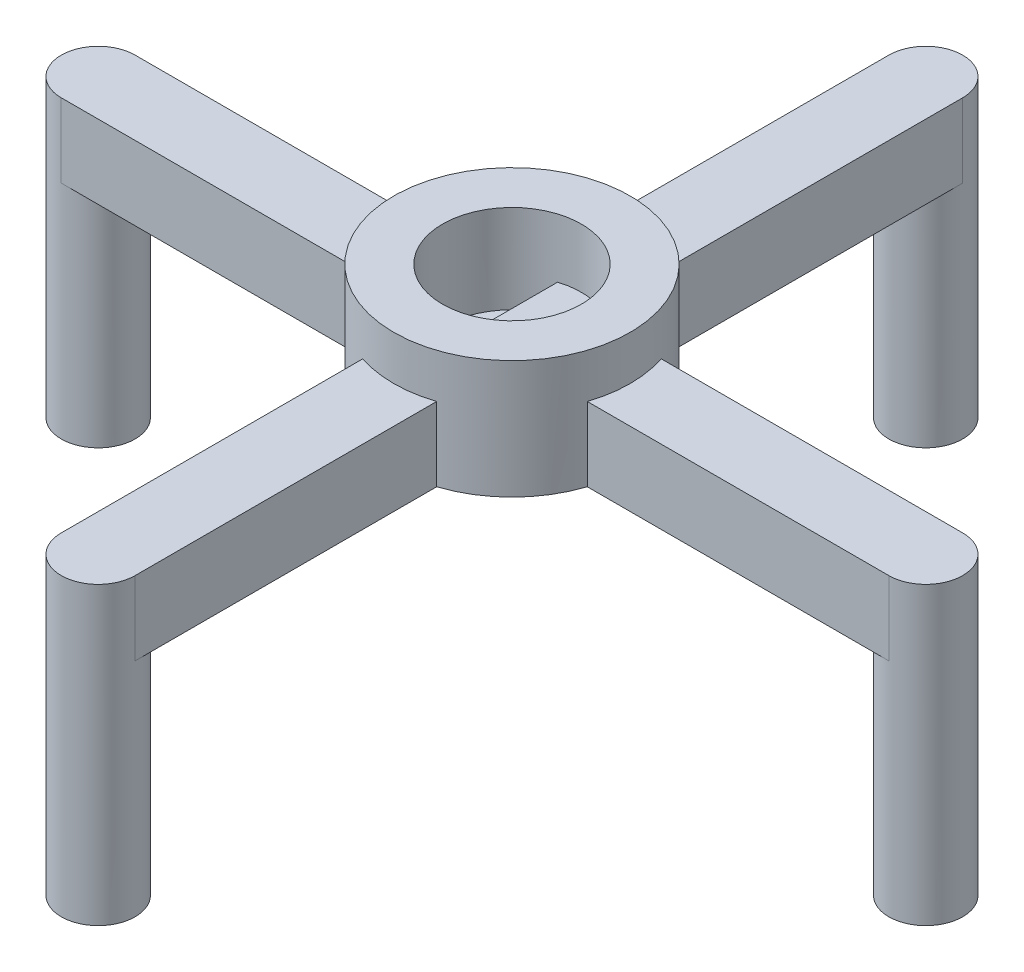
ISO-10303-21;
HEADER;
FILE_DESCRIPTION(('STEP AP214'),'2;1');
FILE_NAME('part.step','',(''),(''),'','','');
FILE_SCHEMA(('AUTOMOTIVE_DESIGN { 1 0 10303 214 1 1 1 1 }'));
ENDSEC;
DATA;
#1=APPLICATION_CONTEXT('core data for automotive mechanical design processes');
#2=APPLICATION_PROTOCOL_DEFINITION('international standard','automotive_design',2000,#1);
#3=PRODUCT_CONTEXT('',#1,'mechanical');
#4=PRODUCT('Part','Part','',(#3));
#5=PRODUCT_RELATED_PRODUCT_CATEGORY('part','',(#4));
#6=PRODUCT_DEFINITION_FORMATION('','',#4);
#7=PRODUCT_DEFINITION_CONTEXT('part definition',#1,'design');
#8=PRODUCT_DEFINITION('design','',#6,#7);
#9=PRODUCT_DEFINITION_SHAPE('','',#8);
#10=(LENGTH_UNIT() NAMED_UNIT(*) SI_UNIT(.MILLI.,.METRE.));
#11=(NAMED_UNIT(*) PLANE_ANGLE_UNIT() SI_UNIT($,.RADIAN.));
#12=(NAMED_UNIT(*) SI_UNIT($,.STERADIAN.) SOLID_ANGLE_UNIT());
#13=UNCERTAINTY_MEASURE_WITH_UNIT(LENGTH_MEASURE(1.E-05),#10,'distance_accuracy_value','');
#14=(GEOMETRIC_REPRESENTATION_CONTEXT(3) GLOBAL_UNCERTAINTY_ASSIGNED_CONTEXT((#13)) GLOBAL_UNIT_ASSIGNED_CONTEXT((#10,
#11,#12)) REPRESENTATION_CONTEXT('',''));
#15=CARTESIAN_POINT('',(0.,0.,0.));
#16=DIRECTION('',(0.,0.,1.));
#17=DIRECTION('',(1.,0.,0.));
#18=AXIS2_PLACEMENT_3D('',#15,#16,#17);
#19=CARTESIAN_POINT('',(0.,5.75,0.));
#20=DIRECTION('',(0.,-1.,0.));
#21=DIRECTION('',(0.,0.,-1.));
#22=AXIS2_PLACEMENT_3D('',#19,#20,#21);
#23=CYLINDRICAL_SURFACE('',#22,1.175);
#24=CARTESIAN_POINT('',(0.,5.75,0.));
#25=DIRECTION('',(0.,1.,0.));
#26=DIRECTION('',(0.,0.,1.));
#27=AXIS2_PLACEMENT_3D('',#24,#25,#26);
#28=CIRCLE('',#27,1.175);
#29=CARTESIAN_POINT('',(0.,5.75,1.175));
#30=VERTEX_POINT('',#29);
#31=EDGE_CURVE('E183',#30,#30,#28,.T.);
#32=ORIENTED_EDGE('',*,*,#31,.T.);
#33=EDGE_LOOP('',(#32));
#34=FACE_BOUND('',#33,.T.);
#35=CARTESIAN_POINT('',(0.,4.25,0.));
#36=DIRECTION('',(0.,1.,0.));
#37=DIRECTION('',(0.,0.,1.));
#38=AXIS2_PLACEMENT_3D('',#35,#36,#37);
#39=CIRCLE('',#38,1.175);
#40=CARTESIAN_POINT('',(-0.35,4.25,-1.12166171370873));
#41=VERTEX_POINT('',#40);
#42=CARTESIAN_POINT('',(-0.35,4.25,1.12166171370873));
#43=VERTEX_POINT('',#42);
#44=EDGE_CURVE('E184',#41,#43,#39,.T.);
#45=ORIENTED_EDGE('',*,*,#44,.F.);
#46=DIRECTION('',(0.,-1.,0.));
#47=VECTOR('',#46,1.);
#48=CARTESIAN_POINT('',(-0.35,4.75,-1.12166171370873));
#49=LINE('',#48,#47);
#50=CARTESIAN_POINT('',(-0.35,4.75,-1.12166171370873));
#51=VERTEX_POINT('',#50);
#52=EDGE_CURVE('E55',#51,#41,#49,.T.);
#53=ORIENTED_EDGE('',*,*,#52,.F.);
#54=CARTESIAN_POINT('',(0.,4.75,0.));
#55=DIRECTION('',(0.,1.,0.));
#56=DIRECTION('',(0.,0.,1.));
#57=AXIS2_PLACEMENT_3D('',#54,#55,#56);
#58=CIRCLE('',#57,1.175);
#59=CARTESIAN_POINT('',(0.349999999999999,4.75,-1.12166171370873));
#60=VERTEX_POINT('',#59);
#61=EDGE_CURVE('E60',#60,#51,#58,.T.);
#62=ORIENTED_EDGE('',*,*,#61,.F.);
#63=DIRECTION('',(0.,-1.,0.));
#64=VECTOR('',#63,1.);
#65=CARTESIAN_POINT('',(0.349999999999999,4.75,-1.12166171370873));
#66=LINE('',#65,#64);
#67=CARTESIAN_POINT('',(0.349999999999999,4.25,-1.12166171370873));
#68=VERTEX_POINT('',#67);
#69=EDGE_CURVE('E187',#60,#68,#66,.T.);
#70=ORIENTED_EDGE('',*,*,#69,.T.);
#71=CARTESIAN_POINT('',(0.35,4.25,1.12166171370873));
#72=VERTEX_POINT('',#71);
#73=EDGE_CURVE('E177',#72,#68,#39,.T.);
#74=ORIENTED_EDGE('',*,*,#73,.F.);
#75=DIRECTION('',(0.,-1.,0.));
#76=VECTOR('',#75,1.);
#77=CARTESIAN_POINT('',(0.35,4.75,1.12166171370873));
#78=LINE('',#77,#76);
#79=CARTESIAN_POINT('',(0.35,4.75,1.12166171370873));
#80=VERTEX_POINT('',#79);
#81=EDGE_CURVE('E191',#80,#72,#78,.T.);
#82=ORIENTED_EDGE('',*,*,#81,.F.);
#83=CARTESIAN_POINT('',(0.,4.75,0.));
#84=DIRECTION('',(0.,1.,0.));
#85=DIRECTION('',(0.,0.,1.));
#86=AXIS2_PLACEMENT_3D('',#83,#84,#85);
#87=CIRCLE('',#86,1.175);
#88=CARTESIAN_POINT('',(-0.35,4.75,1.12166171370873));
#89=VERTEX_POINT('',#88);
#90=EDGE_CURVE('E644',#89,#80,#87,.T.);
#91=ORIENTED_EDGE('',*,*,#90,.F.);
#92=DIRECTION('',(0.,-1.,0.));
#93=VECTOR('',#92,1.);
#94=CARTESIAN_POINT('',(-0.35,4.75,1.12166171370873));
#95=LINE('',#94,#93);
#96=EDGE_CURVE('E208',#89,#43,#95,.T.);
#97=ORIENTED_EDGE('',*,*,#96,.T.);
#98=EDGE_LOOP('',(#45,#53,#62,#70,#74,#82,#91,#97));
#99=FACE_BOUND('',#98,.T.);
#100=ADVANCED_FACE('F39',(#34,#99),#23,.F.);
#101=CARTESIAN_POINT('',(0.,4.25,0.));
#102=DIRECTION('',(0.,-1.,0.));
#103=DIRECTION('',(0.,0.,-1.));
#104=AXIS2_PLACEMENT_3D('',#101,#102,#103);
#105=PLANE('',#104);
#106=DIRECTION('',(0.,0.,1.));
#107=VECTOR('',#106,1.);
#108=CARTESIAN_POINT('',(-0.35,4.25,0.));
#109=LINE('',#108,#107);
#110=EDGE_CURVE('E196',#41,#43,#109,.T.);
#111=ORIENTED_EDGE('',*,*,#110,.F.);
#112=ORIENTED_EDGE('',*,*,#44,.T.);
#113=EDGE_LOOP('',(#111,#112));
#114=FACE_BOUND('',#113,.T.);
#115=ADVANCED_FACE('F451',(#114),#105,.F.);
#116=DIRECTION('',(0.,0.,-1.));
#117=VECTOR('',#116,1.);
#118=CARTESIAN_POINT('',(0.349999999999999,4.25,-1.12166171370873));
#119=LINE('',#118,#117);
#120=EDGE_CURVE('E180',#72,#68,#119,.T.);
#121=ORIENTED_EDGE('',*,*,#120,.F.);
#122=ORIENTED_EDGE('',*,*,#73,.T.);
#123=EDGE_LOOP('',(#121,#122));
#124=FACE_BOUND('',#123,.T.);
#125=ADVANCED_FACE('F178',(#124),#105,.F.);
#126=CARTESIAN_POINT('',(-0.625000000000026,5.,7.626));
#127=DIRECTION('',(1.,0.,0.));
#128=DIRECTION('',(0.,0.,-1.));
#129=AXIS2_PLACEMENT_3D('',#126,#127,#128);
#130=PLANE('',#129);
#131=DIRECTION('',(0.,0.,-1.));
#132=VECTOR('',#131,1.);
#133=CARTESIAN_POINT('',(-0.625000000000026,5.,7.626));
#134=LINE('',#133,#132);
#135=CARTESIAN_POINT('',(-0.625000000000025,5.,7.));
#136=VERTEX_POINT('',#135);
#137=CARTESIAN_POINT('',(-0.625000000000006,5.,1.89983551919633));
#138=VERTEX_POINT('',#137);
#139=EDGE_CURVE('E374',#136,#138,#134,.T.);
#140=ORIENTED_EDGE('',*,*,#139,.T.);
#141=DIRECTION('',(0.,-1.,0.));
#142=VECTOR('',#141,1.);
#143=CARTESIAN_POINT('',(-0.625000000000006,4.25,1.89983551919633));
#144=LINE('',#143,#142);
#145=CARTESIAN_POINT('',(-0.625000000000006,3.75,1.89983551919633));
#146=VERTEX_POINT('',#145);
#147=EDGE_CURVE('E355',#138,#146,#144,.T.);
#148=ORIENTED_EDGE('',*,*,#147,.T.);
#149=DIRECTION('',(0.,0.,-1.));
#150=VECTOR('',#149,1.);
#151=CARTESIAN_POINT('',(-0.625000000000026,3.75,7.626));
#152=LINE('',#151,#150);
#153=CARTESIAN_POINT('',(-0.625000000000024,3.75,7.));
#154=VERTEX_POINT('',#153);
#155=EDGE_CURVE('E373',#154,#146,#152,.T.);
#156=ORIENTED_EDGE('',*,*,#155,.F.);
#157=DIRECTION('',(0.,-1.,0.));
#158=VECTOR('',#157,1.);
#159=CARTESIAN_POINT('',(-0.625000000000025,5.,7.));
#160=LINE('',#159,#158);
#161=EDGE_CURVE('E379',#154,#136,#160,.F.);
#162=ORIENTED_EDGE('',*,*,#161,.T.);
#163=EDGE_LOOP('',(#140,#148,#156,#162));
#164=FACE_BOUND('',#163,.T.);
#165=ADVANCED_FACE('F613',(#164),#130,.F.);
#166=CARTESIAN_POINT('',(0.624999999999973,5.,7.626));
#167=DIRECTION('',(-1.,0.,0.));
#168=DIRECTION('',(0.,0.,1.));
#169=AXIS2_PLACEMENT_3D('',#166,#167,#168);
#170=PLANE('',#169);
#171=DIRECTION('',(0.,-1.,0.));
#172=VECTOR('',#171,1.);
#173=CARTESIAN_POINT('',(0.624999999999993,4.25,1.89983551919634));
#174=LINE('',#173,#172);
#175=CARTESIAN_POINT('',(0.624999999999993,3.75,1.89983551919634));
#176=VERTEX_POINT('',#175);
#177=CARTESIAN_POINT('',(0.624999999999993,5.,1.89983551919634));
#178=VERTEX_POINT('',#177);
#179=EDGE_CURVE('E48',#176,#178,#174,.F.);
#180=ORIENTED_EDGE('',*,*,#179,.T.);
#181=DIRECTION('',(0.,0.,-1.));
#182=VECTOR('',#181,1.);
#183=CARTESIAN_POINT('',(0.624999999999973,5.,7.626));
#184=LINE('',#183,#182);
#185=CARTESIAN_POINT('',(0.624999999999976,5.,7.));
#186=VERTEX_POINT('',#185);
#187=EDGE_CURVE('E369',#186,#178,#184,.T.);
#188=ORIENTED_EDGE('',*,*,#187,.F.);
#189=DIRECTION('',(0.,-1.,0.));
#190=VECTOR('',#189,1.);
#191=CARTESIAN_POINT('',(0.624999999999976,5.,7.));
#192=LINE('',#191,#190);
#193=CARTESIAN_POINT('',(0.624999999999975,3.75,7.));
#194=VERTEX_POINT('',#193);
#195=EDGE_CURVE('E378',#194,#186,#192,.F.);
#196=ORIENTED_EDGE('',*,*,#195,.F.);
#197=DIRECTION('',(0.,0.,-1.));
#198=VECTOR('',#197,1.);
#199=CARTESIAN_POINT('',(0.624999999999973,3.75,7.626));
#200=LINE('',#199,#198);
#201=EDGE_CURVE('E365',#194,#176,#200,.T.);
#202=ORIENTED_EDGE('',*,*,#201,.T.);
#203=EDGE_LOOP('',(#180,#188,#196,#202));
#204=FACE_BOUND('',#203,.T.);
#205=ADVANCED_FACE('F398',(#204),#170,.F.);
#206=CARTESIAN_POINT('',(-0.625000000000026,5.,7.626));
#207=DIRECTION('',(1.,0.,0.));
#208=DIRECTION('',(0.,0.,-1.));
#209=AXIS2_PLACEMENT_3D('',#206,#207,#208);
#210=PLANE('',#209);
#211=DIRECTION('',(0.,-1.,0.));
#212=VECTOR('',#211,1.);
#213=CARTESIAN_POINT('',(-0.624999999999993,4.25,-1.89983551919634));
#214=LINE('',#213,#212);
#215=CARTESIAN_POINT('',(-0.624999999999993,5.,-1.89983551919634));
#216=VERTEX_POINT('',#215);
#217=CARTESIAN_POINT('',(-0.624999999999993,3.75,-1.89983551919634));
#218=VERTEX_POINT('',#217);
#219=EDGE_CURVE('E346',#216,#218,#214,.T.);
#220=ORIENTED_EDGE('',*,*,#219,.F.);
#221=DIRECTION('',(0.,0.,-1.));
#222=VECTOR('',#221,1.);
#223=CARTESIAN_POINT('',(-0.625000000000026,5.,7.626));
#224=LINE('',#223,#222);
#225=CARTESIAN_POINT('',(-0.624999999999975,5.,-7.));
#226=VERTEX_POINT('',#225);
#227=EDGE_CURVE('E327',#216,#226,#224,.T.);
#228=ORIENTED_EDGE('',*,*,#227,.T.);
#229=DIRECTION('',(0.,-1.,0.));
#230=VECTOR('',#229,1.);
#231=CARTESIAN_POINT('',(-0.624999999999975,5.,-7.));
#232=LINE('',#231,#230);
#233=CARTESIAN_POINT('',(-0.624999999999975,3.75,-7.));
#234=VERTEX_POINT('',#233);
#235=EDGE_CURVE('E317',#234,#226,#232,.F.);
#236=ORIENTED_EDGE('',*,*,#235,.F.);
#237=DIRECTION('',(0.,0.,-1.));
#238=VECTOR('',#237,1.);
#239=CARTESIAN_POINT('',(-0.625000000000026,3.75,7.626));
#240=LINE('',#239,#238);
#241=EDGE_CURVE('E322',#218,#234,#240,.T.);
#242=ORIENTED_EDGE('',*,*,#241,.F.);
#243=EDGE_LOOP('',(#220,#228,#236,#242));
#244=FACE_BOUND('',#243,.T.);
#245=ADVANCED_FACE('F426',(#244),#210,.F.);
#246=CARTESIAN_POINT('',(0.624999999999973,5.,7.626));
#247=DIRECTION('',(-1.,0.,0.));
#248=DIRECTION('',(0.,0.,1.));
#249=AXIS2_PLACEMENT_3D('',#246,#247,#248);
#250=PLANE('',#249);
#251=DIRECTION('',(0.,0.,-1.));
#252=VECTOR('',#251,1.);
#253=CARTESIAN_POINT('',(0.624999999999973,5.,7.626));
#254=LINE('',#253,#252);
#255=CARTESIAN_POINT('',(0.625000000000006,5.,-1.89983551919633));
#256=VERTEX_POINT('',#255);
#257=CARTESIAN_POINT('',(0.625000000000024,5.,-7.));
#258=VERTEX_POINT('',#257);
#259=EDGE_CURVE('E311',#256,#258,#254,.T.);
#260=ORIENTED_EDGE('',*,*,#259,.F.);
#261=DIRECTION('',(0.,-1.,0.));
#262=VECTOR('',#261,1.);
#263=CARTESIAN_POINT('',(0.625000000000006,4.25,-1.89983551919633));
#264=LINE('',#263,#262);
#265=CARTESIAN_POINT('',(0.625000000000006,3.75,-1.89983551919633));
#266=VERTEX_POINT('',#265);
#267=EDGE_CURVE('E335',#266,#256,#264,.F.);
#268=ORIENTED_EDGE('',*,*,#267,.F.);
#269=DIRECTION('',(0.,0.,-1.));
#270=VECTOR('',#269,1.);
#271=CARTESIAN_POINT('',(0.624999999999973,3.75,7.626));
#272=LINE('',#271,#270);
#273=CARTESIAN_POINT('',(0.625000000000024,3.75,-7.));
#274=VERTEX_POINT('',#273);
#275=EDGE_CURVE('E316',#266,#274,#272,.T.);
#276=ORIENTED_EDGE('',*,*,#275,.T.);
#277=DIRECTION('',(0.,-1.,0.));
#278=VECTOR('',#277,1.);
#279=CARTESIAN_POINT('',(0.625000000000024,5.,-7.));
#280=LINE('',#279,#278);
#281=EDGE_CURVE('E331',#274,#258,#280,.F.);
#282=ORIENTED_EDGE('',*,*,#281,.T.);
#283=EDGE_LOOP('',(#260,#268,#276,#282));
#284=FACE_BOUND('',#283,.T.);
#285=ADVANCED_FACE('F437',(#284),#250,.F.);
#286=CARTESIAN_POINT('',(7.626,5.,0.625));
#287=DIRECTION('',(0.,0.,-1.));
#288=DIRECTION('',(-1.,0.,0.));
#289=AXIS2_PLACEMENT_3D('',#286,#287,#288);
#290=PLANE('',#289);
#291=DIRECTION('',(0.,-1.,0.));
#292=VECTOR('',#291,1.);
#293=CARTESIAN_POINT('',(-1.89983551919633,4.25,0.625));
#294=LINE('',#293,#292);
#295=CARTESIAN_POINT('',(-1.89983551919633,5.,0.625));
#296=VERTEX_POINT('',#295);
#297=CARTESIAN_POINT('',(-1.89983551919633,3.75,0.625));
#298=VERTEX_POINT('',#297);
#299=EDGE_CURVE('E308',#296,#298,#294,.T.);
#300=ORIENTED_EDGE('',*,*,#299,.F.);
#301=DIRECTION('',(-1.,0.,0.));
#302=VECTOR('',#301,1.);
#303=CARTESIAN_POINT('',(7.626,5.,0.625));
#304=LINE('',#303,#302);
#305=CARTESIAN_POINT('',(-7.,5.,0.625));
#306=VERTEX_POINT('',#305);
#307=EDGE_CURVE('E273',#296,#306,#304,.T.);
#308=ORIENTED_EDGE('',*,*,#307,.T.);
#309=DIRECTION('',(0.,-1.,0.));
#310=VECTOR('',#309,1.);
#311=CARTESIAN_POINT('',(-7.,5.,0.625));
#312=LINE('',#311,#310);
#313=CARTESIAN_POINT('',(-7.,3.75,0.625));
#314=VERTEX_POINT('',#313);
#315=EDGE_CURVE('E279',#314,#306,#312,.F.);
#316=ORIENTED_EDGE('',*,*,#315,.F.);
#317=DIRECTION('',(-1.,0.,0.));
#318=VECTOR('',#317,1.);
#319=CARTESIAN_POINT('',(7.626,3.75,0.625));
#320=LINE('',#319,#318);
#321=EDGE_CURVE('E290',#298,#314,#320,.T.);
#322=ORIENTED_EDGE('',*,*,#321,.F.);
#323=EDGE_LOOP('',(#300,#308,#316,#322));
#324=FACE_BOUND('',#323,.T.);
#325=ADVANCED_FACE('F496',(#324),#290,.F.);
#326=CARTESIAN_POINT('',(7.626,5.,-0.625));
#327=DIRECTION('',(0.,0.,1.));
#328=DIRECTION('',(1.,0.,0.));
#329=AXIS2_PLACEMENT_3D('',#326,#327,#328);
#330=PLANE('',#329);
#331=DIRECTION('',(-1.,0.,0.));
#332=VECTOR('',#331,1.);
#333=CARTESIAN_POINT('',(7.626,5.,-0.625));
#334=LINE('',#333,#332);
#335=CARTESIAN_POINT('',(-1.89983551919633,5.,-0.625));
#336=VERTEX_POINT('',#335);
#337=CARTESIAN_POINT('',(-7.,5.,-0.625));
#338=VERTEX_POINT('',#337);
#339=EDGE_CURVE('E278',#336,#338,#334,.T.);
#340=ORIENTED_EDGE('',*,*,#339,.F.);
#341=DIRECTION('',(0.,-1.,0.));
#342=VECTOR('',#341,1.);
#343=CARTESIAN_POINT('',(-1.89983551919633,4.25,-0.625));
#344=LINE('',#343,#342);
#345=CARTESIAN_POINT('',(-1.89983551919633,3.75,-0.624999999999999));
#346=VERTEX_POINT('',#345);
#347=EDGE_CURVE('E289',#346,#336,#344,.F.);
#348=ORIENTED_EDGE('',*,*,#347,.F.);
#349=DIRECTION('',(-1.,0.,0.));
#350=VECTOR('',#349,1.);
#351=CARTESIAN_POINT('',(7.626,3.75,-0.625));
#352=LINE('',#351,#350);
#353=CARTESIAN_POINT('',(-7.,3.75,-0.625));
#354=VERTEX_POINT('',#353);
#355=EDGE_CURVE('E284',#346,#354,#352,.T.);
#356=ORIENTED_EDGE('',*,*,#355,.T.);
#357=DIRECTION('',(0.,-1.,0.));
#358=VECTOR('',#357,1.);
#359=CARTESIAN_POINT('',(-7.,5.,-0.625));
#360=LINE('',#359,#358);
#361=EDGE_CURVE('E294',#354,#338,#360,.F.);
#362=ORIENTED_EDGE('',*,*,#361,.T.);
#363=EDGE_LOOP('',(#340,#348,#356,#362));
#364=FACE_BOUND('',#363,.T.);
#365=ADVANCED_FACE('F480',(#364),#330,.F.);
#366=CARTESIAN_POINT('',(7.626,5.,0.625));
#367=DIRECTION('',(0.,0.,-1.));
#368=DIRECTION('',(-1.,0.,0.));
#369=AXIS2_PLACEMENT_3D('',#366,#367,#368);
#370=PLANE('',#369);
#371=DIRECTION('',(-1.,0.,0.));
#372=VECTOR('',#371,1.);
#373=CARTESIAN_POINT('',(7.626,5.,0.625));
#374=LINE('',#373,#372);
#375=CARTESIAN_POINT('',(7.,5.,0.625000000000001));
#376=VERTEX_POINT('',#375);
#377=CARTESIAN_POINT('',(1.89983551919633,5.,0.625));
#378=VERTEX_POINT('',#377);
#379=EDGE_CURVE('E246',#376,#378,#374,.T.);
#380=ORIENTED_EDGE('',*,*,#379,.T.);
#381=DIRECTION('',(0.,-1.,0.));
#382=VECTOR('',#381,1.);
#383=CARTESIAN_POINT('',(1.89983551919633,4.25,0.625));
#384=LINE('',#383,#382);
#385=CARTESIAN_POINT('',(1.89983551919633,3.75,0.625));
#386=VERTEX_POINT('',#385);
#387=EDGE_CURVE('E270',#386,#378,#384,.F.);
#388=ORIENTED_EDGE('',*,*,#387,.F.);
#389=DIRECTION('',(-1.,0.,0.));
#390=VECTOR('',#389,1.);
#391=CARTESIAN_POINT('',(7.626,3.75,0.625));
#392=LINE('',#391,#390);
#393=CARTESIAN_POINT('',(7.,3.75,0.625));
#394=VERTEX_POINT('',#393);
#395=EDGE_CURVE('E245',#394,#386,#392,.T.);
#396=ORIENTED_EDGE('',*,*,#395,.F.);
#397=DIRECTION('',(0.,-1.,0.));
#398=VECTOR('',#397,1.);
#399=CARTESIAN_POINT('',(7.,5.,0.625));
#400=LINE('',#399,#398);
#401=EDGE_CURVE('E251',#394,#376,#400,.F.);
#402=ORIENTED_EDGE('',*,*,#401,.T.);
#403=EDGE_LOOP('',(#380,#388,#396,#402));
#404=FACE_BOUND('',#403,.T.);
#405=ADVANCED_FACE('F476',(#404),#370,.F.);
#406=CARTESIAN_POINT('',(7.626,5.,-0.625));
#407=DIRECTION('',(0.,0.,1.));
#408=DIRECTION('',(1.,0.,0.));
#409=AXIS2_PLACEMENT_3D('',#406,#407,#408);
#410=PLANE('',#409);
#411=DIRECTION('',(0.,-1.,0.));
#412=VECTOR('',#411,1.);
#413=CARTESIAN_POINT('',(1.89983551919633,4.25,-0.625));
#414=LINE('',#413,#412);
#415=CARTESIAN_POINT('',(1.89983551919633,5.,-0.625));
#416=VERTEX_POINT('',#415);
#417=CARTESIAN_POINT('',(1.89983551919633,3.75,-0.624999999999999));
#418=VERTEX_POINT('',#417);
#419=EDGE_CURVE('E261',#416,#418,#414,.T.);
#420=ORIENTED_EDGE('',*,*,#419,.F.);
#421=DIRECTION('',(-1.,0.,0.));
#422=VECTOR('',#421,1.);
#423=CARTESIAN_POINT('',(7.626,5.,-0.625));
#424=LINE('',#423,#422);
#425=CARTESIAN_POINT('',(7.,5.,-0.625000000000001));
#426=VERTEX_POINT('',#425);
#427=EDGE_CURVE('E241',#426,#416,#424,.T.);
#428=ORIENTED_EDGE('',*,*,#427,.F.);
#429=DIRECTION('',(0.,-1.,0.));
#430=VECTOR('',#429,1.);
#431=CARTESIAN_POINT('',(7.,5.,-0.625));
#432=LINE('',#431,#430);
#433=CARTESIAN_POINT('',(7.,3.75,-0.625));
#434=VERTEX_POINT('',#433);
#435=EDGE_CURVE('E250',#434,#426,#432,.F.);
#436=ORIENTED_EDGE('',*,*,#435,.F.);
#437=DIRECTION('',(-1.,0.,0.));
#438=VECTOR('',#437,1.);
#439=CARTESIAN_POINT('',(7.626,3.75,-0.625));
#440=LINE('',#439,#438);
#441=EDGE_CURVE('E237',#434,#418,#440,.T.);
#442=ORIENTED_EDGE('',*,*,#441,.T.);
#443=EDGE_LOOP('',(#420,#428,#436,#442));
#444=FACE_BOUND('',#443,.T.);
#445=ADVANCED_FACE('F479',(#444),#410,.F.);
#446=CARTESIAN_POINT('',(0.,4.25,0.));
#447=DIRECTION('',(0.,-1.,0.));
#448=DIRECTION('',(0.,0.,-1.));
#449=AXIS2_PLACEMENT_3D('',#446,#447,#448);
#450=CYLINDRICAL_SURFACE('',#449,2.);
#451=CARTESIAN_POINT('',(0.,3.75,0.));
#452=DIRECTION('',(0.,-1.,0.));
#453=DIRECTION('',(0.,0.,-1.));
#454=AXIS2_PLACEMENT_3D('',#451,#452,#453);
#455=CIRCLE('',#454,2.);
#456=EDGE_CURVE('E356',#346,#218,#455,.T.);
#457=ORIENTED_EDGE('',*,*,#456,.F.);
#458=ORIENTED_EDGE('',*,*,#347,.T.);
#459=CARTESIAN_POINT('',(0.,5.,0.));
#460=DIRECTION('',(0.,1.,0.));
#461=DIRECTION('',(0.,0.,1.));
#462=AXIS2_PLACEMENT_3D('',#459,#460,#461);
#463=CIRCLE('',#462,2.);
#464=EDGE_CURVE('E220',#296,#336,#463,.F.);
#465=ORIENTED_EDGE('',*,*,#464,.F.);
#466=ORIENTED_EDGE('',*,*,#299,.T.);
#467=EDGE_CURVE('E351',#146,#298,#455,.T.);
#468=ORIENTED_EDGE('',*,*,#467,.F.);
#469=ORIENTED_EDGE('',*,*,#147,.F.);
#470=CARTESIAN_POINT('',(0.,5.,0.));
#471=DIRECTION('',(0.,1.,0.));
#472=DIRECTION('',(0.,0.,1.));
#473=AXIS2_PLACEMENT_3D('',#470,#471,#472);
#474=CIRCLE('',#473,2.);
#475=EDGE_CURVE('E228',#178,#138,#474,.F.);
#476=ORIENTED_EDGE('',*,*,#475,.F.);
#477=ORIENTED_EDGE('',*,*,#179,.F.);
#478=EDGE_CURVE('E350',#386,#176,#455,.T.);
#479=ORIENTED_EDGE('',*,*,#478,.F.);
#480=ORIENTED_EDGE('',*,*,#387,.T.);
#481=CARTESIAN_POINT('',(0.,5.,0.));
#482=DIRECTION('',(0.,1.,0.));
#483=DIRECTION('',(0.,0.,1.));
#484=AXIS2_PLACEMENT_3D('',#481,#482,#483);
#485=CIRCLE('',#484,2.);
#486=EDGE_CURVE('E11',#416,#378,#485,.F.);
#487=ORIENTED_EDGE('',*,*,#486,.F.);
#488=ORIENTED_EDGE('',*,*,#419,.T.);
#489=EDGE_CURVE('E357',#266,#418,#455,.T.);
#490=ORIENTED_EDGE('',*,*,#489,.F.);
#491=ORIENTED_EDGE('',*,*,#267,.T.);
#492=CARTESIAN_POINT('',(0.,5.,0.));
#493=DIRECTION('',(0.,1.,0.));
#494=DIRECTION('',(0.,0.,1.));
#495=AXIS2_PLACEMENT_3D('',#492,#493,#494);
#496=CIRCLE('',#495,2.);
#497=EDGE_CURVE('E224',#216,#256,#496,.F.);
#498=ORIENTED_EDGE('',*,*,#497,.F.);
#499=ORIENTED_EDGE('',*,*,#219,.T.);
#500=EDGE_LOOP('',(#457,#458,#465,#466,#468,#469,#476,#477,#479,#480,#487,#488,#490,#491,#498,#499));
#501=FACE_BOUND('',#500,.T.);
#502=CARTESIAN_POINT('',(0.,5.75,0.));
#503=DIRECTION('',(0.,1.,0.));
#504=DIRECTION('',(0.,0.,1.));
#505=AXIS2_PLACEMENT_3D('',#502,#503,#504);
#506=CIRCLE('',#505,2.);
#507=CARTESIAN_POINT('',(0.,5.75,2.));
#508=VERTEX_POINT('',#507);
#509=EDGE_CURVE('E215',#508,#508,#506,.T.);
#510=ORIENTED_EDGE('',*,*,#509,.F.);
#511=EDGE_LOOP('',(#510));
#512=FACE_BOUND('',#511,.T.);
#513=ADVANCED_FACE('F402',(#501,#512),#450,.T.);
#514=CARTESIAN_POINT('',(0.,0.,7.));
#515=DIRECTION('',(0.,1.,0.));
#516=DIRECTION('',(-1.,0.,0.));
#517=AXIS2_PLACEMENT_3D('',#514,#515,#516);
#518=PLANE('',#517);
#519=CARTESIAN_POINT('',(0.,0.,7.));
#520=DIRECTION('',(0.,1.,0.));
#521=DIRECTION('',(-1.,0.,0.));
#522=AXIS2_PLACEMENT_3D('',#519,#520,#521);
#523=CIRCLE('',#522,0.625000000000001);
#524=CARTESIAN_POINT('',(-0.625000000000025,0.,7.));
#525=VERTEX_POINT('',#524);
#526=EDGE_CURVE('E360',#525,#525,#523,.T.);
#527=ORIENTED_EDGE('',*,*,#526,.F.);
#528=EDGE_LOOP('',(#527));
#529=FACE_BOUND('',#528,.T.);
#530=ADVANCED_FACE('F538',(#529),#518,.F.);
#531=CARTESIAN_POINT('',(0.,5.,7.));
#532=DIRECTION('',(0.,-1.,0.));
#533=DIRECTION('',(1.,0.,0.));
#534=AXIS2_PLACEMENT_3D('',#531,#532,#533);
#535=CYLINDRICAL_SURFACE('',#534,0.625000000000001);
#536=ORIENTED_EDGE('',*,*,#526,.T.);
#537=EDGE_LOOP('',(#536));
#538=FACE_BOUND('',#537,.T.);
#539=CARTESIAN_POINT('',(0.,3.75,7.));
#540=DIRECTION('',(0.,1.,0.));
#541=DIRECTION('',(-1.,0.,0.));
#542=AXIS2_PLACEMENT_3D('',#539,#540,#541);
#543=CIRCLE('',#542,0.625000000000001);
#544=EDGE_CURVE('E386',#154,#194,#543,.F.);
#545=ORIENTED_EDGE('',*,*,#544,.T.);
#546=ORIENTED_EDGE('',*,*,#195,.T.);
#547=CARTESIAN_POINT('',(0.,5.,7.));
#548=DIRECTION('',(0.,1.,0.));
#549=DIRECTION('',(-1.,0.,0.));
#550=AXIS2_PLACEMENT_3D('',#547,#548,#549);
#551=CIRCLE('',#550,0.625000000000001);
#552=EDGE_CURVE('E361',#136,#186,#551,.T.);
#553=ORIENTED_EDGE('',*,*,#552,.F.);
#554=ORIENTED_EDGE('',*,*,#161,.F.);
#555=EDGE_LOOP('',(#545,#546,#553,#554));
#556=FACE_BOUND('',#555,.T.);
#557=ADVANCED_FACE('F410',(#538,#556),#535,.T.);
#558=CARTESIAN_POINT('',(0.624999999999973,3.75,7.626));
#559=DIRECTION('',(0.,1.,0.));
#560=DIRECTION('',(-1.,0.,0.));
#561=AXIS2_PLACEMENT_3D('',#558,#559,#560);
#562=PLANE('',#561);
#563=ORIENTED_EDGE('',*,*,#489,.T.);
#564=ORIENTED_EDGE('',*,*,#441,.F.);
#565=CARTESIAN_POINT('',(7.,3.75,0.));
#566=DIRECTION('',(0.,1.,0.));
#567=DIRECTION('',(0.,0.,1.));
#568=AXIS2_PLACEMENT_3D('',#565,#566,#567);
#569=CIRCLE('',#568,0.625000000000001);
#570=EDGE_CURVE('E257',#394,#434,#569,.F.);
#571=ORIENTED_EDGE('',*,*,#570,.F.);
#572=ORIENTED_EDGE('',*,*,#395,.T.);
#573=ORIENTED_EDGE('',*,*,#478,.T.);
#574=ORIENTED_EDGE('',*,*,#201,.F.);
#575=ORIENTED_EDGE('',*,*,#544,.F.);
#576=ORIENTED_EDGE('',*,*,#155,.T.);
#577=ORIENTED_EDGE('',*,*,#467,.T.);
#578=ORIENTED_EDGE('',*,*,#321,.T.);
#579=CARTESIAN_POINT('',(-7.,3.75,0.));
#580=DIRECTION('',(0.,-1.,0.));
#581=DIRECTION('',(0.,0.,-1.));
#582=AXIS2_PLACEMENT_3D('',#579,#580,#581);
#583=CIRCLE('',#582,0.625);
#584=EDGE_CURVE('E285',#314,#354,#583,.F.);
#585=ORIENTED_EDGE('',*,*,#584,.T.);
#586=ORIENTED_EDGE('',*,*,#355,.F.);
#587=ORIENTED_EDGE('',*,*,#456,.T.);
#588=ORIENTED_EDGE('',*,*,#241,.T.);
#589=CARTESIAN_POINT('',(0.,3.75,-7.));
#590=DIRECTION('',(0.,-1.,0.));
#591=DIRECTION('',(1.,0.,0.));
#592=AXIS2_PLACEMENT_3D('',#589,#590,#591);
#593=CIRCLE('',#592,0.625);
#594=EDGE_CURVE('E323',#234,#274,#593,.F.);
#595=ORIENTED_EDGE('',*,*,#594,.T.);
#596=ORIENTED_EDGE('',*,*,#275,.F.);
#597=EDGE_LOOP('',(#563,#564,#571,#572,#573,#574,#575,#576,#577,#578,#585,#586,#587,#588,#595,#596));
#598=FACE_BOUND('',#597,.T.);
#599=ADVANCED_FACE('F414',(#598),#562,.F.);
#600=CARTESIAN_POINT('',(0.,5.,-7.));
#601=DIRECTION('',(0.,1.,0.));
#602=DIRECTION('',(-1.,0.,0.));
#603=AXIS2_PLACEMENT_3D('',#600,#601,#602);
#604=PLANE('',#603);
#605=ORIENTED_EDGE('',*,*,#187,.T.);
#606=ORIENTED_EDGE('',*,*,#475,.T.);
#607=ORIENTED_EDGE('',*,*,#139,.F.);
#608=ORIENTED_EDGE('',*,*,#552,.T.);
#609=EDGE_LOOP('',(#605,#606,#607,#608));
#610=FACE_BOUND('',#609,.T.);
#611=ADVANCED_FACE('F41',(#610),#604,.T.);
#612=CARTESIAN_POINT('',(0.,5.,-7.));
#613=DIRECTION('',(0.,1.,0.));
#614=DIRECTION('',(-1.,0.,0.));
#615=AXIS2_PLACEMENT_3D('',#612,#613,#614);
#616=PLANE('',#615);
#617=ORIENTED_EDGE('',*,*,#227,.F.);
#618=ORIENTED_EDGE('',*,*,#497,.T.);
#619=ORIENTED_EDGE('',*,*,#259,.T.);
#620=CARTESIAN_POINT('',(0.,5.,-7.));
#621=DIRECTION('',(0.,1.,0.));
#622=DIRECTION('',(-1.,0.,0.));
#623=AXIS2_PLACEMENT_3D('',#620,#621,#622);
#624=CIRCLE('',#623,0.625);
#625=EDGE_CURVE('E318',#258,#226,#624,.T.);
#626=ORIENTED_EDGE('',*,*,#625,.T.);
#627=EDGE_LOOP('',(#617,#618,#619,#626));
#628=FACE_BOUND('',#627,.T.);
#629=ADVANCED_FACE('F439',(#628),#616,.T.);
#630=CARTESIAN_POINT('',(0.,5.,-7.));
#631=DIRECTION('',(0.,-1.,0.));
#632=DIRECTION('',(1.,0.,0.));
#633=AXIS2_PLACEMENT_3D('',#630,#631,#632);
#634=CYLINDRICAL_SURFACE('',#633,0.625);
#635=ORIENTED_EDGE('',*,*,#625,.F.);
#636=ORIENTED_EDGE('',*,*,#281,.F.);
#637=ORIENTED_EDGE('',*,*,#594,.F.);
#638=ORIENTED_EDGE('',*,*,#235,.T.);
#639=EDGE_LOOP('',(#635,#636,#637,#638));
#640=FACE_BOUND('',#639,.T.);
#641=CARTESIAN_POINT('',(0.,0.,-7.));
#642=DIRECTION('',(0.,1.,0.));
#643=DIRECTION('',(-1.,0.,0.));
#644=AXIS2_PLACEMENT_3D('',#641,#642,#643);
#645=CIRCLE('',#644,0.625);
#646=CARTESIAN_POINT('',(-0.624999999999975,0.,-7.));
#647=VERTEX_POINT('',#646);
#648=EDGE_CURVE('E312',#647,#647,#645,.T.);
#649=ORIENTED_EDGE('',*,*,#648,.T.);
#650=EDGE_LOOP('',(#649));
#651=FACE_BOUND('',#650,.T.);
#652=ADVANCED_FACE('F431',(#640,#651),#634,.T.);
#653=CARTESIAN_POINT('',(0.,0.,-7.));
#654=DIRECTION('',(0.,1.,0.));
#655=DIRECTION('',(-1.,0.,0.));
#656=AXIS2_PLACEMENT_3D('',#653,#654,#655);
#657=PLANE('',#656);
#658=ORIENTED_EDGE('',*,*,#648,.F.);
#659=EDGE_LOOP('',(#658));
#660=FACE_BOUND('',#659,.T.);
#661=ADVANCED_FACE('F446',(#660),#657,.F.);
#662=CARTESIAN_POINT('',(-7.,5.,0.));
#663=DIRECTION('',(0.,-1.,0.));
#664=DIRECTION('',(0.,0.,-1.));
#665=AXIS2_PLACEMENT_3D('',#662,#663,#664);
#666=CYLINDRICAL_SURFACE('',#665,0.625);
#667=CARTESIAN_POINT('',(-7.,5.,0.));
#668=DIRECTION('',(0.,1.,0.));
#669=DIRECTION('',(0.,0.,1.));
#670=AXIS2_PLACEMENT_3D('',#667,#668,#669);
#671=CIRCLE('',#670,0.625);
#672=EDGE_CURVE('E280',#338,#306,#671,.T.);
#673=ORIENTED_EDGE('',*,*,#672,.F.);
#674=ORIENTED_EDGE('',*,*,#361,.F.);
#675=ORIENTED_EDGE('',*,*,#584,.F.);
#676=ORIENTED_EDGE('',*,*,#315,.T.);
#677=EDGE_LOOP('',(#673,#674,#675,#676));
#678=FACE_BOUND('',#677,.T.);
#679=CARTESIAN_POINT('',(-7.,0.,0.));
#680=DIRECTION('',(0.,1.,0.));
#681=DIRECTION('',(0.,0.,1.));
#682=AXIS2_PLACEMENT_3D('',#679,#680,#681);
#683=CIRCLE('',#682,0.625);
#684=CARTESIAN_POINT('',(-7.,0.,0.625));
#685=VERTEX_POINT('',#684);
#686=EDGE_CURVE('E274',#685,#685,#683,.T.);
#687=ORIENTED_EDGE('',*,*,#686,.T.);
#688=EDGE_LOOP('',(#687));
#689=FACE_BOUND('',#688,.T.);
#690=ADVANCED_FACE('F488',(#678,#689),#666,.T.);
#691=CARTESIAN_POINT('',(-7.,5.,0.));
#692=DIRECTION('',(0.,1.,0.));
#693=DIRECTION('',(0.,0.,1.));
#694=AXIS2_PLACEMENT_3D('',#691,#692,#693);
#695=PLANE('',#694);
#696=ORIENTED_EDGE('',*,*,#307,.F.);
#697=ORIENTED_EDGE('',*,*,#464,.T.);
#698=ORIENTED_EDGE('',*,*,#339,.T.);
#699=ORIENTED_EDGE('',*,*,#672,.T.);
#700=EDGE_LOOP('',(#696,#697,#698,#699));
#701=FACE_BOUND('',#700,.T.);
#702=ADVANCED_FACE('F491',(#701),#695,.T.);
#703=CARTESIAN_POINT('',(-7.,0.,0.));
#704=DIRECTION('',(0.,1.,0.));
#705=DIRECTION('',(0.,0.,1.));
#706=AXIS2_PLACEMENT_3D('',#703,#704,#705);
#707=PLANE('',#706);
#708=ORIENTED_EDGE('',*,*,#686,.F.);
#709=EDGE_LOOP('',(#708));
#710=FACE_BOUND('',#709,.T.);
#711=ADVANCED_FACE('F471',(#710),#707,.F.);
#712=CARTESIAN_POINT('',(7.,0.,0.));
#713=DIRECTION('',(0.,1.,0.));
#714=DIRECTION('',(0.,0.,1.));
#715=AXIS2_PLACEMENT_3D('',#712,#713,#714);
#716=PLANE('',#715);
#717=CARTESIAN_POINT('',(7.,0.,0.));
#718=DIRECTION('',(0.,1.,0.));
#719=DIRECTION('',(0.,0.,1.));
#720=AXIS2_PLACEMENT_3D('',#717,#718,#719);
#721=CIRCLE('',#720,0.625000000000001);
#722=CARTESIAN_POINT('',(7.,0.,0.625000000000001));
#723=VERTEX_POINT('',#722);
#724=EDGE_CURVE('E232',#723,#723,#721,.T.);
#725=ORIENTED_EDGE('',*,*,#724,.F.);
#726=EDGE_LOOP('',(#725));
#727=FACE_BOUND('',#726,.T.);
#728=ADVANCED_FACE('F467',(#727),#716,.F.);
#729=CARTESIAN_POINT('',(7.,5.,0.));
#730=DIRECTION('',(0.,-1.,0.));
#731=DIRECTION('',(0.,0.,-1.));
#732=AXIS2_PLACEMENT_3D('',#729,#730,#731);
#733=CYLINDRICAL_SURFACE('',#732,0.625000000000001);
#734=ORIENTED_EDGE('',*,*,#724,.T.);
#735=EDGE_LOOP('',(#734));
#736=FACE_BOUND('',#735,.T.);
#737=ORIENTED_EDGE('',*,*,#570,.T.);
#738=ORIENTED_EDGE('',*,*,#435,.T.);
#739=CARTESIAN_POINT('',(7.,5.,0.));
#740=DIRECTION('',(0.,1.,0.));
#741=DIRECTION('',(0.,0.,1.));
#742=AXIS2_PLACEMENT_3D('',#739,#740,#741);
#743=CIRCLE('',#742,0.625000000000001);
#744=EDGE_CURVE('E233',#376,#426,#743,.T.);
#745=ORIENTED_EDGE('',*,*,#744,.F.);
#746=ORIENTED_EDGE('',*,*,#401,.F.);
#747=EDGE_LOOP('',(#737,#738,#745,#746));
#748=FACE_BOUND('',#747,.T.);
#749=ADVANCED_FACE('F470',(#736,#748),#733,.T.);
#750=CARTESIAN_POINT('',(-7.,5.,0.));
#751=DIRECTION('',(0.,1.,0.));
#752=DIRECTION('',(0.,0.,1.));
#753=AXIS2_PLACEMENT_3D('',#750,#751,#752);
#754=PLANE('',#753);
#755=ORIENTED_EDGE('',*,*,#427,.T.);
#756=ORIENTED_EDGE('',*,*,#486,.T.);
#757=ORIENTED_EDGE('',*,*,#379,.F.);
#758=ORIENTED_EDGE('',*,*,#744,.T.);
#759=EDGE_LOOP('',(#755,#756,#757,#758));
#760=FACE_BOUND('',#759,.T.);
#761=ADVANCED_FACE('F465',(#760),#754,.T.);
#762=CARTESIAN_POINT('',(0.,5.75,0.));
#763=DIRECTION('',(0.,1.,0.));
#764=DIRECTION('',(0.,0.,1.));
#765=AXIS2_PLACEMENT_3D('',#762,#763,#764);
#766=PLANE('',#765);
#767=ORIENTED_EDGE('',*,*,#509,.T.);
#768=EDGE_LOOP('',(#767));
#769=FACE_BOUND('',#768,.T.);
#770=ORIENTED_EDGE('',*,*,#31,.F.);
#771=EDGE_LOOP('',(#770));
#772=FACE_BOUND('',#771,.T.);
#773=ADVANCED_FACE('F462',(#769,#772),#766,.T.);
#774=CARTESIAN_POINT('',(-0.35,4.75,0.));
#775=DIRECTION('',(1.,0.,0.));
#776=DIRECTION('',(0.,0.,-1.));
#777=AXIS2_PLACEMENT_3D('',#774,#775,#776);
#778=PLANE('',#777);
#779=ORIENTED_EDGE('',*,*,#110,.T.);
#780=ORIENTED_EDGE('',*,*,#96,.F.);
#781=DIRECTION('',(0.,0.,1.));
#782=VECTOR('',#781,1.);
#783=CARTESIAN_POINT('',(-0.35,4.75,0.));
#784=LINE('',#783,#782);
#785=EDGE_CURVE('E200',#51,#89,#784,.T.);
#786=ORIENTED_EDGE('',*,*,#785,.F.);
#787=ORIENTED_EDGE('',*,*,#52,.T.);
#788=EDGE_LOOP('',(#779,#780,#786,#787));
#789=FACE_BOUND('',#788,.T.);
#790=ADVANCED_FACE('F460',(#789),#778,.F.);
#791=CARTESIAN_POINT('',(0.349999999999999,4.75,-1.12166171370873));
#792=DIRECTION('',(-1.,0.,0.));
#793=DIRECTION('',(0.,0.,1.));
#794=AXIS2_PLACEMENT_3D('',#791,#792,#793);
#795=PLANE('',#794);
#796=ORIENTED_EDGE('',*,*,#120,.T.);
#797=ORIENTED_EDGE('',*,*,#69,.F.);
#798=DIRECTION('',(0.,0.,-1.));
#799=VECTOR('',#798,1.);
#800=CARTESIAN_POINT('',(0.349999999999999,4.75,-1.12166171370873));
#801=LINE('',#800,#799);
#802=EDGE_CURVE('E192',#80,#60,#801,.T.);
#803=ORIENTED_EDGE('',*,*,#802,.F.);
#804=ORIENTED_EDGE('',*,*,#81,.T.);
#805=EDGE_LOOP('',(#796,#797,#803,#804));
#806=FACE_BOUND('',#805,.T.);
#807=ADVANCED_FACE('F194',(#806),#795,.F.);
#808=CARTESIAN_POINT('',(0.,4.75,0.));
#809=DIRECTION('',(0.,1.,0.));
#810=DIRECTION('',(0.,0.,1.));
#811=AXIS2_PLACEMENT_3D('',#808,#809,#810);
#812=PLANE('',#811);
#813=ORIENTED_EDGE('',*,*,#61,.T.);
#814=ORIENTED_EDGE('',*,*,#785,.T.);
#815=ORIENTED_EDGE('',*,*,#90,.T.);
#816=ORIENTED_EDGE('',*,*,#802,.T.);
#817=EDGE_LOOP('',(#813,#814,#815,#816));
#818=FACE_BOUND('',#817,.T.);
#819=ADVANCED_FACE('F629',(#818),#812,.T.);
#820=CLOSED_SHELL('',(#100,#115,#125,#165,#205,#245,#285,#325,#365,#405,#445,#513,#530,#557,
#599,#611,#629,#652,#661,#690,#702,#711,#728,#749,#761,#773,#790,#807,#819));
#821=MANIFOLD_SOLID_BREP('B2',#820);
#822=ADVANCED_BREP_SHAPE_REPRESENTATION('',(#18,#821),#14);
#823=SHAPE_DEFINITION_REPRESENTATION(#9,#822);
ENDSEC;
END-ISO-10303-21;
